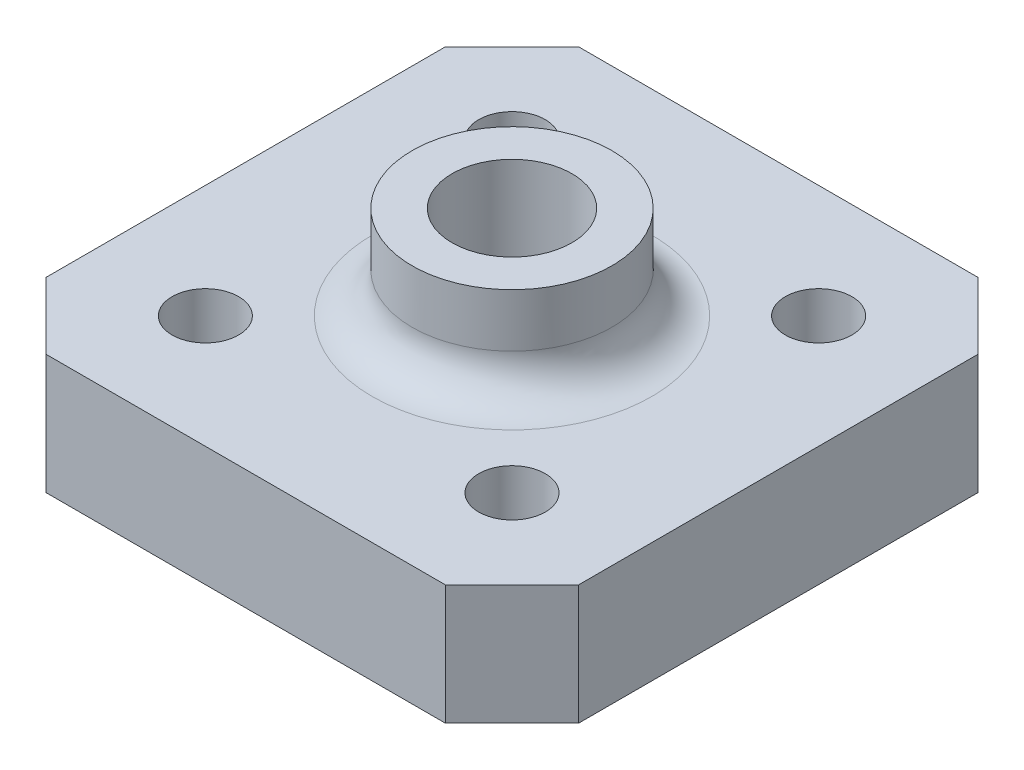
ISO-10303-21;
HEADER;
FILE_DESCRIPTION(('STEP AP214'),'2;1');
FILE_NAME('part.step','',(''),(''),'','','');
FILE_SCHEMA(('AUTOMOTIVE_DESIGN { 1 0 10303 214 1 1 1 1 }'));
ENDSEC;
DATA;
#1=APPLICATION_CONTEXT('core data for automotive mechanical design processes');
#2=APPLICATION_PROTOCOL_DEFINITION('international standard','automotive_design',2000,#1);
#3=PRODUCT_CONTEXT('',#1,'mechanical');
#4=PRODUCT('Part','Part','',(#3));
#5=PRODUCT_RELATED_PRODUCT_CATEGORY('part','',(#4));
#6=PRODUCT_DEFINITION_FORMATION('','',#4);
#7=PRODUCT_DEFINITION_CONTEXT('part definition',#1,'design');
#8=PRODUCT_DEFINITION('design','',#6,#7);
#9=PRODUCT_DEFINITION_SHAPE('','',#8);
#10=(LENGTH_UNIT() NAMED_UNIT(*) SI_UNIT(.MILLI.,.METRE.));
#11=(NAMED_UNIT(*) PLANE_ANGLE_UNIT() SI_UNIT($,.RADIAN.));
#12=(NAMED_UNIT(*) SI_UNIT($,.STERADIAN.) SOLID_ANGLE_UNIT());
#13=UNCERTAINTY_MEASURE_WITH_UNIT(LENGTH_MEASURE(1.E-05),#10,'distance_accuracy_value','');
#14=(GEOMETRIC_REPRESENTATION_CONTEXT(3) GLOBAL_UNCERTAINTY_ASSIGNED_CONTEXT((#13)) GLOBAL_UNIT_ASSIGNED_CONTEXT((#10,
#11,#12)) REPRESENTATION_CONTEXT('',''));
#15=CARTESIAN_POINT('',(0.,0.,0.));
#16=DIRECTION('',(0.,0.,1.));
#17=DIRECTION('',(1.,0.,0.));
#18=AXIS2_PLACEMENT_3D('',#15,#16,#17);
#19=CARTESIAN_POINT('',(0.,9.,0.));
#20=DIRECTION('',(0.,1.,0.));
#21=DIRECTION('',(0.,0.,1.));
#22=AXIS2_PLACEMENT_3D('',#19,#20,#21);
#23=PLANE('',#22);
#24=CARTESIAN_POINT('',(0.,9.,0.));
#25=DIRECTION('',(0.,1.,0.));
#26=DIRECTION('',(0.,0.,1.));
#27=AXIS2_PLACEMENT_3D('',#24,#25,#26);
#28=CIRCLE('',#27,10.5);
#29=CARTESIAN_POINT('',(0.,9.,10.5));
#30=VERTEX_POINT('',#29);
#31=EDGE_CURVE('E205',#30,#30,#28,.F.);
#32=ORIENTED_EDGE('',*,*,#31,.T.);
#33=EDGE_LOOP('',(#32));
#34=FACE_BOUND('',#33,.T.);
#35=DIRECTION('',(-1.,0.,0.));
#36=VECTOR('',#35,1.);
#37=CARTESIAN_POINT('',(-20.,9.,-20.));
#38=LINE('',#37,#36);
#39=CARTESIAN_POINT('',(15.,9.,-20.));
#40=VERTEX_POINT('',#39);
#41=CARTESIAN_POINT('',(-15.,9.,-20.));
#42=VERTEX_POINT('',#41);
#43=EDGE_CURVE('E170',#40,#42,#38,.T.);
#44=ORIENTED_EDGE('',*,*,#43,.T.);
#45=DIRECTION('',(0.707106781186549,0.,-0.707106781186547));
#46=VECTOR('',#45,1.);
#47=CARTESIAN_POINT('',(-17.5,9.,-17.5));
#48=LINE('',#47,#46);
#49=CARTESIAN_POINT('',(-20.,9.,-15.));
#50=VERTEX_POINT('',#49);
#51=EDGE_CURVE('E231',#42,#50,#48,.F.);
#52=ORIENTED_EDGE('',*,*,#51,.T.);
#53=DIRECTION('',(0.,0.,1.));
#54=VECTOR('',#53,1.);
#55=CARTESIAN_POINT('',(-20.,9.,-20.));
#56=LINE('',#55,#54);
#57=CARTESIAN_POINT('',(-20.,9.,15.));
#58=VERTEX_POINT('',#57);
#59=EDGE_CURVE('E260',#50,#58,#56,.T.);
#60=ORIENTED_EDGE('',*,*,#59,.T.);
#61=DIRECTION('',(-0.707106781186547,0.,-0.707106781186549));
#62=VECTOR('',#61,1.);
#63=CARTESIAN_POINT('',(-17.5,9.,17.5));
#64=LINE('',#63,#62);
#65=CARTESIAN_POINT('',(-15.,9.,20.));
#66=VERTEX_POINT('',#65);
#67=EDGE_CURVE('E229',#58,#66,#64,.F.);
#68=ORIENTED_EDGE('',*,*,#67,.T.);
#69=DIRECTION('',(1.,0.,0.));
#70=VECTOR('',#69,1.);
#71=CARTESIAN_POINT('',(-20.,9.,20.));
#72=LINE('',#71,#70);
#73=CARTESIAN_POINT('',(15.,9.,20.));
#74=VERTEX_POINT('',#73);
#75=EDGE_CURVE('E243',#66,#74,#72,.T.);
#76=ORIENTED_EDGE('',*,*,#75,.T.);
#77=DIRECTION('',(-0.707106781186549,0.,0.707106781186546));
#78=VECTOR('',#77,1.);
#79=CARTESIAN_POINT('',(17.5,9.,17.5));
#80=LINE('',#79,#78);
#81=CARTESIAN_POINT('',(20.,9.,15.));
#82=VERTEX_POINT('',#81);
#83=EDGE_CURVE('E54',#74,#82,#80,.F.);
#84=ORIENTED_EDGE('',*,*,#83,.T.);
#85=DIRECTION('',(0.,0.,-1.));
#86=VECTOR('',#85,1.);
#87=CARTESIAN_POINT('',(20.,9.,-20.));
#88=LINE('',#87,#86);
#89=CARTESIAN_POINT('',(20.,9.,-15.));
#90=VERTEX_POINT('',#89);
#91=EDGE_CURVE('E255',#82,#90,#88,.T.);
#92=ORIENTED_EDGE('',*,*,#91,.T.);
#93=DIRECTION('',(0.707106781186547,0.,0.707106781186549));
#94=VECTOR('',#93,1.);
#95=CARTESIAN_POINT('',(17.5,9.,-17.5));
#96=LINE('',#95,#94);
#97=EDGE_CURVE('E226',#90,#40,#96,.F.);
#98=ORIENTED_EDGE('',*,*,#97,.T.);
#99=EDGE_LOOP('',(#44,#52,#60,#68,#76,#84,#92,#98));
#100=FACE_BOUND('',#99,.T.);
#101=CARTESIAN_POINT('',(-11.5147186257614,9.,-11.5147186257614));
#102=DIRECTION('',(0.,1.,0.));
#103=DIRECTION('',(0.,0.,1.));
#104=AXIS2_PLACEMENT_3D('',#101,#102,#103);
#105=CIRCLE('',#104,2.5);
#106=CARTESIAN_POINT('',(-11.5147186257614,9.,-9.01471862576144));
#107=VERTEX_POINT('',#106);
#108=EDGE_CURVE('E534',#107,#107,#105,.T.);
#109=ORIENTED_EDGE('',*,*,#108,.F.);
#110=EDGE_LOOP('',(#109));
#111=FACE_BOUND('',#110,.T.);
#112=CARTESIAN_POINT('',(-11.5147186257614,9.,11.5147186257614));
#113=DIRECTION('',(0.,1.,0.));
#114=DIRECTION('',(0.,0.,1.));
#115=AXIS2_PLACEMENT_3D('',#112,#113,#114);
#116=CIRCLE('',#115,2.5);
#117=CARTESIAN_POINT('',(-11.5147186257614,9.,14.0147186257614));
#118=VERTEX_POINT('',#117);
#119=EDGE_CURVE('E538',#118,#118,#116,.T.);
#120=ORIENTED_EDGE('',*,*,#119,.F.);
#121=EDGE_LOOP('',(#120));
#122=FACE_BOUND('',#121,.T.);
#123=CARTESIAN_POINT('',(11.5147186257614,9.,11.5147186257614));
#124=DIRECTION('',(0.,1.,0.));
#125=DIRECTION('',(0.,0.,1.));
#126=AXIS2_PLACEMENT_3D('',#123,#124,#125);
#127=CIRCLE('',#126,2.5);
#128=CARTESIAN_POINT('',(11.5147186257614,9.,14.0147186257614));
#129=VERTEX_POINT('',#128);
#130=EDGE_CURVE('E542',#129,#129,#127,.T.);
#131=ORIENTED_EDGE('',*,*,#130,.F.);
#132=EDGE_LOOP('',(#131));
#133=FACE_BOUND('',#132,.T.);
#134=CARTESIAN_POINT('',(11.5147186257614,9.,-11.5147186257614));
#135=DIRECTION('',(0.,1.,0.));
#136=DIRECTION('',(0.,0.,1.));
#137=AXIS2_PLACEMENT_3D('',#134,#135,#136);
#138=CIRCLE('',#137,2.5);
#139=CARTESIAN_POINT('',(11.5147186257614,9.,-9.01471862576143));
#140=VERTEX_POINT('',#139);
#141=EDGE_CURVE('E545',#140,#140,#138,.T.);
#142=ORIENTED_EDGE('',*,*,#141,.F.);
#143=EDGE_LOOP('',(#142));
#144=FACE_BOUND('',#143,.T.);
#145=ADVANCED_FACE('F33',(#34,#100,#111,#122,#133,#144),#23,.T.);
#146=CARTESIAN_POINT('',(0.,0.,0.));
#147=DIRECTION('',(0.,1.,0.));
#148=DIRECTION('',(0.,0.,1.));
#149=AXIS2_PLACEMENT_3D('',#146,#147,#148);
#150=PLANE('',#149);
#151=CARTESIAN_POINT('',(11.5147186257614,0.,-11.5147186257614));
#152=DIRECTION('',(0.,1.,0.));
#153=DIRECTION('',(0.,0.,1.));
#154=AXIS2_PLACEMENT_3D('',#151,#152,#153);
#155=CIRCLE('',#154,2.5);
#156=CARTESIAN_POINT('',(11.5147186257614,0.,-9.01471862576143));
#157=VERTEX_POINT('',#156);
#158=EDGE_CURVE('E559',#157,#157,#155,.T.);
#159=ORIENTED_EDGE('',*,*,#158,.T.);
#160=EDGE_LOOP('',(#159));
#161=FACE_BOUND('',#160,.T.);
#162=CARTESIAN_POINT('',(11.5147186257614,0.,11.5147186257614));
#163=DIRECTION('',(0.,1.,0.));
#164=DIRECTION('',(0.,0.,1.));
#165=AXIS2_PLACEMENT_3D('',#162,#163,#164);
#166=CIRCLE('',#165,2.5);
#167=CARTESIAN_POINT('',(11.5147186257614,0.,14.0147186257614));
#168=VERTEX_POINT('',#167);
#169=EDGE_CURVE('E549',#168,#168,#166,.T.);
#170=ORIENTED_EDGE('',*,*,#169,.T.);
#171=EDGE_LOOP('',(#170));
#172=FACE_BOUND('',#171,.T.);
#173=CARTESIAN_POINT('',(-11.5147186257614,0.,11.5147186257614));
#174=DIRECTION('',(0.,1.,0.));
#175=DIRECTION('',(0.,0.,1.));
#176=AXIS2_PLACEMENT_3D('',#173,#174,#175);
#177=CIRCLE('',#176,2.5);
#178=CARTESIAN_POINT('',(-11.5147186257614,0.,14.0147186257614));
#179=VERTEX_POINT('',#178);
#180=EDGE_CURVE('E546',#179,#179,#177,.T.);
#181=ORIENTED_EDGE('',*,*,#180,.T.);
#182=EDGE_LOOP('',(#181));
#183=FACE_BOUND('',#182,.T.);
#184=CARTESIAN_POINT('',(-11.5147186257614,0.,-11.5147186257614));
#185=DIRECTION('',(0.,1.,0.));
#186=DIRECTION('',(0.,0.,1.));
#187=AXIS2_PLACEMENT_3D('',#184,#185,#186);
#188=CIRCLE('',#187,2.5);
#189=CARTESIAN_POINT('',(-11.5147186257614,0.,-9.01471862576144));
#190=VERTEX_POINT('',#189);
#191=EDGE_CURVE('E563',#190,#190,#188,.T.);
#192=ORIENTED_EDGE('',*,*,#191,.T.);
#193=EDGE_LOOP('',(#192));
#194=FACE_BOUND('',#193,.T.);
#195=DIRECTION('',(0.,0.,1.));
#196=VECTOR('',#195,1.);
#197=CARTESIAN_POINT('',(-20.,0.,-20.));
#198=LINE('',#197,#196);
#199=CARTESIAN_POINT('',(-20.,0.,-15.));
#200=VERTEX_POINT('',#199);
#201=CARTESIAN_POINT('',(-20.,0.,15.));
#202=VERTEX_POINT('',#201);
#203=EDGE_CURVE('E196',#200,#202,#198,.T.);
#204=ORIENTED_EDGE('',*,*,#203,.F.);
#205=DIRECTION('',(-0.707106781186549,0.,0.707106781186547));
#206=VECTOR('',#205,1.);
#207=CARTESIAN_POINT('',(-20.,0.,-15.));
#208=LINE('',#207,#206);
#209=CARTESIAN_POINT('',(-15.,0.,-20.));
#210=VERTEX_POINT('',#209);
#211=EDGE_CURVE('E219',#200,#210,#208,.F.);
#212=ORIENTED_EDGE('',*,*,#211,.T.);
#213=DIRECTION('',(-1.,0.,0.));
#214=VECTOR('',#213,1.);
#215=CARTESIAN_POINT('',(-20.,0.,-20.));
#216=LINE('',#215,#214);
#217=CARTESIAN_POINT('',(15.,0.,-20.));
#218=VERTEX_POINT('',#217);
#219=EDGE_CURVE('E193',#218,#210,#216,.T.);
#220=ORIENTED_EDGE('',*,*,#219,.F.);
#221=DIRECTION('',(-0.707106781186547,0.,-0.707106781186549));
#222=VECTOR('',#221,1.);
#223=CARTESIAN_POINT('',(15.,0.,-20.));
#224=LINE('',#223,#222);
#225=CARTESIAN_POINT('',(20.,0.,-15.));
#226=VERTEX_POINT('',#225);
#227=EDGE_CURVE('E213',#218,#226,#224,.F.);
#228=ORIENTED_EDGE('',*,*,#227,.T.);
#229=DIRECTION('',(0.,0.,-1.));
#230=VECTOR('',#229,1.);
#231=CARTESIAN_POINT('',(20.,0.,-20.));
#232=LINE('',#231,#230);
#233=CARTESIAN_POINT('',(20.,0.,15.));
#234=VERTEX_POINT('',#233);
#235=EDGE_CURVE('E191',#234,#226,#232,.T.);
#236=ORIENTED_EDGE('',*,*,#235,.F.);
#237=DIRECTION('',(0.707106781186549,0.,-0.707106781186546));
#238=VECTOR('',#237,1.);
#239=CARTESIAN_POINT('',(20.,0.,15.));
#240=LINE('',#239,#238);
#241=CARTESIAN_POINT('',(15.,0.,20.));
#242=VERTEX_POINT('',#241);
#243=EDGE_CURVE('E215',#234,#242,#240,.F.);
#244=ORIENTED_EDGE('',*,*,#243,.T.);
#245=DIRECTION('',(1.,0.,0.));
#246=VECTOR('',#245,1.);
#247=CARTESIAN_POINT('',(-20.,0.,20.));
#248=LINE('',#247,#246);
#249=CARTESIAN_POINT('',(-15.,0.,20.));
#250=VERTEX_POINT('',#249);
#251=EDGE_CURVE('E199',#250,#242,#248,.T.);
#252=ORIENTED_EDGE('',*,*,#251,.F.);
#253=DIRECTION('',(0.707106781186547,0.,0.707106781186549));
#254=VECTOR('',#253,1.);
#255=CARTESIAN_POINT('',(-15.,0.,20.));
#256=LINE('',#255,#254);
#257=EDGE_CURVE('E217',#250,#202,#256,.F.);
#258=ORIENTED_EDGE('',*,*,#257,.T.);
#259=EDGE_LOOP('',(#204,#212,#220,#228,#236,#244,#252,#258));
#260=FACE_BOUND('',#259,.T.);
#261=DIRECTION('',(0.5,0.,-0.866025403784439));
#262=VECTOR('',#261,1.);
#263=CARTESIAN_POINT('',(3.75277674973256,0.,6.5));
#264=LINE('',#263,#262);
#265=CARTESIAN_POINT('',(3.75277674973256,0.,6.5));
#266=VERTEX_POINT('',#265);
#267=CARTESIAN_POINT('',(7.50555349946513,0.,0.));
#268=VERTEX_POINT('',#267);
#269=EDGE_CURVE('E166',#266,#268,#264,.T.);
#270=ORIENTED_EDGE('',*,*,#269,.T.);
#271=DIRECTION('',(-0.5,0.,-0.866025403784439));
#272=VECTOR('',#271,1.);
#273=CARTESIAN_POINT('',(7.50555349946513,0.,0.));
#274=LINE('',#273,#272);
#275=CARTESIAN_POINT('',(3.75277674973256,0.,-6.5));
#276=VERTEX_POINT('',#275);
#277=EDGE_CURVE('E169',#268,#276,#274,.T.);
#278=ORIENTED_EDGE('',*,*,#277,.T.);
#279=DIRECTION('',(-1.,0.,0.));
#280=VECTOR('',#279,1.);
#281=CARTESIAN_POINT('',(3.75277674973256,0.,-6.5));
#282=LINE('',#281,#280);
#283=CARTESIAN_POINT('',(-3.75277674973257,0.,-6.5));
#284=VERTEX_POINT('',#283);
#285=EDGE_CURVE('E173',#276,#284,#282,.T.);
#286=ORIENTED_EDGE('',*,*,#285,.T.);
#287=DIRECTION('',(-0.5,0.,0.866025403784438));
#288=VECTOR('',#287,1.);
#289=CARTESIAN_POINT('',(-3.75277674973257,0.,-6.5));
#290=LINE('',#289,#288);
#291=CARTESIAN_POINT('',(-7.50555349946514,0.,0.));
#292=VERTEX_POINT('',#291);
#293=EDGE_CURVE('E176',#284,#292,#290,.T.);
#294=ORIENTED_EDGE('',*,*,#293,.T.);
#295=DIRECTION('',(0.5,0.,0.866025403784439));
#296=VECTOR('',#295,1.);
#297=CARTESIAN_POINT('',(-7.50555349946514,0.,0.));
#298=LINE('',#297,#296);
#299=CARTESIAN_POINT('',(-3.75277674973257,0.,6.5));
#300=VERTEX_POINT('',#299);
#301=EDGE_CURVE('E179',#292,#300,#298,.T.);
#302=ORIENTED_EDGE('',*,*,#301,.T.);
#303=DIRECTION('',(1.,0.,0.));
#304=VECTOR('',#303,1.);
#305=CARTESIAN_POINT('',(-3.75277674973257,0.,6.5));
#306=LINE('',#305,#304);
#307=EDGE_CURVE('E152',#300,#266,#306,.T.);
#308=ORIENTED_EDGE('',*,*,#307,.T.);
#309=EDGE_LOOP('',(#270,#278,#286,#294,#302,#308));
#310=FACE_BOUND('',#309,.T.);
#311=ADVANCED_FACE('F248',(#161,#172,#183,#194,#260,#310),#150,.F.);
#312=CARTESIAN_POINT('',(20.,6.,-20.));
#313=DIRECTION('',(-1.,0.,0.));
#314=DIRECTION('',(0.,0.,1.));
#315=AXIS2_PLACEMENT_3D('',#312,#313,#314);
#316=PLANE('',#315);
#317=ORIENTED_EDGE('',*,*,#91,.F.);
#318=DIRECTION('',(0.,-1.,0.));
#319=VECTOR('',#318,1.);
#320=CARTESIAN_POINT('',(20.,6.,15.));
#321=LINE('',#320,#319);
#322=EDGE_CURVE('E11',#82,#234,#321,.T.);
#323=ORIENTED_EDGE('',*,*,#322,.T.);
#324=ORIENTED_EDGE('',*,*,#235,.T.);
#325=DIRECTION('',(0.,1.,0.));
#326=VECTOR('',#325,1.);
#327=CARTESIAN_POINT('',(20.,6.,-15.));
#328=LINE('',#327,#326);
#329=EDGE_CURVE('E41',#226,#90,#328,.T.);
#330=ORIENTED_EDGE('',*,*,#329,.T.);
#331=EDGE_LOOP('',(#317,#323,#324,#330));
#332=FACE_BOUND('',#331,.T.);
#333=ADVANCED_FACE('F254',(#332),#316,.F.);
#334=CARTESIAN_POINT('',(-20.,6.,-20.));
#335=DIRECTION('',(0.,0.,1.));
#336=DIRECTION('',(1.,0.,0.));
#337=AXIS2_PLACEMENT_3D('',#334,#335,#336);
#338=PLANE('',#337);
#339=ORIENTED_EDGE('',*,*,#219,.T.);
#340=DIRECTION('',(0.,1.,0.));
#341=VECTOR('',#340,1.);
#342=CARTESIAN_POINT('',(-15.,6.,-20.));
#343=LINE('',#342,#341);
#344=EDGE_CURVE('E224',#210,#42,#343,.T.);
#345=ORIENTED_EDGE('',*,*,#344,.T.);
#346=ORIENTED_EDGE('',*,*,#43,.F.);
#347=DIRECTION('',(0.,-1.,0.));
#348=VECTOR('',#347,1.);
#349=CARTESIAN_POINT('',(15.,6.,-20.));
#350=LINE('',#349,#348);
#351=EDGE_CURVE('E221',#40,#218,#350,.T.);
#352=ORIENTED_EDGE('',*,*,#351,.T.);
#353=EDGE_LOOP('',(#339,#345,#346,#352));
#354=FACE_BOUND('',#353,.T.);
#355=ADVANCED_FACE('F464',(#354),#338,.F.);
#356=CARTESIAN_POINT('',(-20.,6.,-20.));
#357=DIRECTION('',(1.,0.,0.));
#358=DIRECTION('',(0.,0.,-1.));
#359=AXIS2_PLACEMENT_3D('',#356,#357,#358);
#360=PLANE('',#359);
#361=ORIENTED_EDGE('',*,*,#59,.F.);
#362=DIRECTION('',(0.,-1.,0.));
#363=VECTOR('',#362,1.);
#364=CARTESIAN_POINT('',(-20.,6.,-15.));
#365=LINE('',#364,#363);
#366=EDGE_CURVE('E210',#50,#200,#365,.T.);
#367=ORIENTED_EDGE('',*,*,#366,.T.);
#368=ORIENTED_EDGE('',*,*,#203,.T.);
#369=DIRECTION('',(0.,1.,0.));
#370=VECTOR('',#369,1.);
#371=CARTESIAN_POINT('',(-20.,6.,15.));
#372=LINE('',#371,#370);
#373=EDGE_CURVE('E208',#202,#58,#372,.T.);
#374=ORIENTED_EDGE('',*,*,#373,.T.);
#375=EDGE_LOOP('',(#361,#367,#368,#374));
#376=FACE_BOUND('',#375,.T.);
#377=ADVANCED_FACE('F288',(#376),#360,.F.);
#378=CARTESIAN_POINT('',(-20.,6.,20.));
#379=DIRECTION('',(0.,0.,-1.));
#380=DIRECTION('',(-1.,0.,0.));
#381=AXIS2_PLACEMENT_3D('',#378,#379,#380);
#382=PLANE('',#381);
#383=ORIENTED_EDGE('',*,*,#75,.F.);
#384=DIRECTION('',(0.,-1.,0.));
#385=VECTOR('',#384,1.);
#386=CARTESIAN_POINT('',(-15.,6.,20.));
#387=LINE('',#386,#385);
#388=EDGE_CURVE('E235',#66,#250,#387,.T.);
#389=ORIENTED_EDGE('',*,*,#388,.T.);
#390=ORIENTED_EDGE('',*,*,#251,.T.);
#391=DIRECTION('',(0.,1.,0.));
#392=VECTOR('',#391,1.);
#393=CARTESIAN_POINT('',(15.,6.,20.));
#394=LINE('',#393,#392);
#395=EDGE_CURVE('E233',#242,#74,#394,.T.);
#396=ORIENTED_EDGE('',*,*,#395,.T.);
#397=EDGE_LOOP('',(#383,#389,#390,#396));
#398=FACE_BOUND('',#397,.T.);
#399=ADVANCED_FACE('F241',(#398),#382,.F.);
#400=CARTESIAN_POINT('',(3.75277674973256,6.,6.5));
#401=DIRECTION('',(-0.866025403784439,0.,-0.5));
#402=DIRECTION('',(-0.5,0.,0.866025403784439));
#403=AXIS2_PLACEMENT_3D('',#400,#401,#402);
#404=PLANE('',#403);
#405=ORIENTED_EDGE('',*,*,#269,.F.);
#406=DIRECTION('',(0.,-1.,0.));
#407=VECTOR('',#406,1.);
#408=CARTESIAN_POINT('',(3.75277674973256,6.,6.5));
#409=LINE('',#408,#407);
#410=CARTESIAN_POINT('',(3.75277674973256,6.,6.5));
#411=VERTEX_POINT('',#410);
#412=EDGE_CURVE('E146',#411,#266,#409,.T.);
#413=ORIENTED_EDGE('',*,*,#412,.F.);
#414=DIRECTION('',(0.5,0.,-0.866025403784439));
#415=VECTOR('',#414,1.);
#416=CARTESIAN_POINT('',(3.75277674973256,6.,6.5));
#417=LINE('',#416,#415);
#418=CARTESIAN_POINT('',(7.50555349946513,6.,0.));
#419=VERTEX_POINT('',#418);
#420=EDGE_CURVE('E142',#411,#419,#417,.T.);
#421=ORIENTED_EDGE('',*,*,#420,.T.);
#422=DIRECTION('',(0.,-1.,0.));
#423=VECTOR('',#422,1.);
#424=CARTESIAN_POINT('',(7.50555349946513,6.,0.));
#425=LINE('',#424,#423);
#426=EDGE_CURVE('E188',#419,#268,#425,.T.);
#427=ORIENTED_EDGE('',*,*,#426,.T.);
#428=EDGE_LOOP('',(#405,#413,#421,#427));
#429=FACE_BOUND('',#428,.T.);
#430=ADVANCED_FACE('F280',(#429),#404,.T.);
#431=CARTESIAN_POINT('',(7.50555349946513,6.,0.));
#432=DIRECTION('',(-0.866025403784439,0.,0.5));
#433=DIRECTION('',(0.5,0.,0.866025403784439));
#434=AXIS2_PLACEMENT_3D('',#431,#432,#433);
#435=PLANE('',#434);
#436=ORIENTED_EDGE('',*,*,#277,.F.);
#437=ORIENTED_EDGE('',*,*,#426,.F.);
#438=DIRECTION('',(-0.5,0.,-0.866025403784439));
#439=VECTOR('',#438,1.);
#440=CARTESIAN_POINT('',(7.50555349946513,6.,0.));
#441=LINE('',#440,#439);
#442=CARTESIAN_POINT('',(3.75277674973256,6.,-6.5));
#443=VERTEX_POINT('',#442);
#444=EDGE_CURVE('E265',#419,#443,#441,.T.);
#445=ORIENTED_EDGE('',*,*,#444,.T.);
#446=DIRECTION('',(0.,-1.,0.));
#447=VECTOR('',#446,1.);
#448=CARTESIAN_POINT('',(3.75277674973256,6.,-6.5));
#449=LINE('',#448,#447);
#450=EDGE_CURVE('E186',#443,#276,#449,.T.);
#451=ORIENTED_EDGE('',*,*,#450,.T.);
#452=EDGE_LOOP('',(#436,#437,#445,#451));
#453=FACE_BOUND('',#452,.T.);
#454=ADVANCED_FACE('F278',(#453),#435,.T.);
#455=CARTESIAN_POINT('',(3.75277674973256,6.,-6.5));
#456=DIRECTION('',(0.,0.,1.));
#457=DIRECTION('',(1.,0.,0.));
#458=AXIS2_PLACEMENT_3D('',#455,#456,#457);
#459=PLANE('',#458);
#460=ORIENTED_EDGE('',*,*,#285,.F.);
#461=ORIENTED_EDGE('',*,*,#450,.F.);
#462=DIRECTION('',(-1.,0.,0.));
#463=VECTOR('',#462,1.);
#464=CARTESIAN_POINT('',(3.75277674973256,6.,-6.5));
#465=LINE('',#464,#463);
#466=CARTESIAN_POINT('',(-3.75277674973257,6.,-6.5));
#467=VERTEX_POINT('',#466);
#468=EDGE_CURVE('E162',#443,#467,#465,.T.);
#469=ORIENTED_EDGE('',*,*,#468,.T.);
#470=DIRECTION('',(0.,-1.,0.));
#471=VECTOR('',#470,1.);
#472=CARTESIAN_POINT('',(-3.75277674973257,6.,-6.5));
#473=LINE('',#472,#471);
#474=EDGE_CURVE('E184',#467,#284,#473,.T.);
#475=ORIENTED_EDGE('',*,*,#474,.T.);
#476=EDGE_LOOP('',(#460,#461,#469,#475));
#477=FACE_BOUND('',#476,.T.);
#478=ADVANCED_FACE('F272',(#477),#459,.T.);
#479=CARTESIAN_POINT('',(-3.75277674973257,6.,-6.5));
#480=DIRECTION('',(0.866025403784439,0.,0.5));
#481=DIRECTION('',(0.5,0.,-0.866025403784439));
#482=AXIS2_PLACEMENT_3D('',#479,#480,#481);
#483=PLANE('',#482);
#484=ORIENTED_EDGE('',*,*,#293,.F.);
#485=ORIENTED_EDGE('',*,*,#474,.F.);
#486=DIRECTION('',(-0.5,0.,0.866025403784438));
#487=VECTOR('',#486,1.);
#488=CARTESIAN_POINT('',(-3.75277674973257,6.,-6.5));
#489=LINE('',#488,#487);
#490=CARTESIAN_POINT('',(-7.50555349946514,6.,0.));
#491=VERTEX_POINT('',#490);
#492=EDGE_CURVE('E160',#467,#491,#489,.T.);
#493=ORIENTED_EDGE('',*,*,#492,.T.);
#494=DIRECTION('',(0.,-1.,0.));
#495=VECTOR('',#494,1.);
#496=CARTESIAN_POINT('',(-7.50555349946514,6.,0.));
#497=LINE('',#496,#495);
#498=EDGE_CURVE('E156',#491,#292,#497,.T.);
#499=ORIENTED_EDGE('',*,*,#498,.T.);
#500=EDGE_LOOP('',(#484,#485,#493,#499));
#501=FACE_BOUND('',#500,.T.);
#502=ADVANCED_FACE('F275',(#501),#483,.T.);
#503=CARTESIAN_POINT('',(-7.50555349946514,6.,0.));
#504=DIRECTION('',(0.866025403784439,0.,-0.5));
#505=DIRECTION('',(-0.5,0.,-0.866025403784439));
#506=AXIS2_PLACEMENT_3D('',#503,#504,#505);
#507=PLANE('',#506);
#508=ORIENTED_EDGE('',*,*,#301,.F.);
#509=ORIENTED_EDGE('',*,*,#498,.F.);
#510=DIRECTION('',(0.5,0.,0.866025403784439));
#511=VECTOR('',#510,1.);
#512=CARTESIAN_POINT('',(-7.50555349946514,6.,0.));
#513=LINE('',#512,#511);
#514=CARTESIAN_POINT('',(-3.75277674973257,6.,6.5));
#515=VERTEX_POINT('',#514);
#516=EDGE_CURVE('E139',#491,#515,#513,.T.);
#517=ORIENTED_EDGE('',*,*,#516,.T.);
#518=DIRECTION('',(0.,-1.,0.));
#519=VECTOR('',#518,1.);
#520=CARTESIAN_POINT('',(-3.75277674973257,6.,6.5));
#521=LINE('',#520,#519);
#522=EDGE_CURVE('E149',#515,#300,#521,.T.);
#523=ORIENTED_EDGE('',*,*,#522,.T.);
#524=EDGE_LOOP('',(#508,#509,#517,#523));
#525=FACE_BOUND('',#524,.T.);
#526=ADVANCED_FACE('F159',(#525),#507,.T.);
#527=CARTESIAN_POINT('',(-3.75277674973257,6.,6.5));
#528=DIRECTION('',(0.,0.,-1.));
#529=DIRECTION('',(-1.,0.,0.));
#530=AXIS2_PLACEMENT_3D('',#527,#528,#529);
#531=PLANE('',#530);
#532=ORIENTED_EDGE('',*,*,#307,.F.);
#533=ORIENTED_EDGE('',*,*,#522,.F.);
#534=DIRECTION('',(1.,0.,0.));
#535=VECTOR('',#534,1.);
#536=CARTESIAN_POINT('',(-3.75277674973257,6.,6.5));
#537=LINE('',#536,#535);
#538=EDGE_CURVE('E134',#515,#411,#537,.T.);
#539=ORIENTED_EDGE('',*,*,#538,.T.);
#540=ORIENTED_EDGE('',*,*,#412,.T.);
#541=EDGE_LOOP('',(#532,#533,#539,#540));
#542=FACE_BOUND('',#541,.T.);
#543=ADVANCED_FACE('F150',(#542),#531,.T.);
#544=CARTESIAN_POINT('',(0.,6.,0.));
#545=DIRECTION('',(0.,1.,0.));
#546=DIRECTION('',(0.,0.,1.));
#547=AXIS2_PLACEMENT_3D('',#544,#545,#546);
#548=PLANE('',#547);
#549=ORIENTED_EDGE('',*,*,#420,.F.);
#550=ORIENTED_EDGE('',*,*,#538,.F.);
#551=ORIENTED_EDGE('',*,*,#516,.F.);
#552=ORIENTED_EDGE('',*,*,#492,.F.);
#553=ORIENTED_EDGE('',*,*,#468,.F.);
#554=ORIENTED_EDGE('',*,*,#444,.F.);
#555=EDGE_LOOP('',(#549,#550,#551,#552,#553,#554));
#556=FACE_BOUND('',#555,.T.);
#557=CARTESIAN_POINT('',(0.,6.,0.));
#558=DIRECTION('',(0.,1.,0.));
#559=DIRECTION('',(0.,0.,1.));
#560=AXIS2_PLACEMENT_3D('',#557,#558,#559);
#561=CIRCLE('',#560,4.5);
#562=CARTESIAN_POINT('',(0.,6.,4.5));
#563=VERTEX_POINT('',#562);
#564=EDGE_CURVE('E524',#563,#563,#561,.T.);
#565=ORIENTED_EDGE('',*,*,#564,.T.);
#566=EDGE_LOOP('',(#565));
#567=FACE_BOUND('',#566,.T.);
#568=ADVANCED_FACE('F136',(#556,#567),#548,.F.);
#569=CARTESIAN_POINT('',(0.,9.,0.));
#570=DIRECTION('',(0.,-1.,0.));
#571=DIRECTION('',(0.,0.,-1.));
#572=AXIS2_PLACEMENT_3D('',#569,#570,#571);
#573=CYLINDRICAL_SURFACE('',#572,4.5);
#574=ORIENTED_EDGE('',*,*,#564,.F.);
#575=EDGE_LOOP('',(#574));
#576=FACE_BOUND('',#575,.T.);
#577=CARTESIAN_POINT('',(0.,16.,0.));
#578=DIRECTION('',(0.,1.,0.));
#579=DIRECTION('',(0.,0.,1.));
#580=AXIS2_PLACEMENT_3D('',#577,#578,#579);
#581=CIRCLE('',#580,4.5);
#582=CARTESIAN_POINT('',(0.,16.,4.5));
#583=VERTEX_POINT('',#582);
#584=EDGE_CURVE('E571',#583,#583,#581,.T.);
#585=ORIENTED_EDGE('',*,*,#584,.T.);
#586=EDGE_LOOP('',(#585));
#587=FACE_BOUND('',#586,.T.);
#588=ADVANCED_FACE('F300',(#576,#587),#573,.F.);
#589=CARTESIAN_POINT('',(-11.5147186257614,-15.,-11.5147186257614));
#590=DIRECTION('',(0.,1.,0.));
#591=DIRECTION('',(0.,0.,1.));
#592=AXIS2_PLACEMENT_3D('',#589,#590,#591);
#593=CYLINDRICAL_SURFACE('',#592,2.5);
#594=ORIENTED_EDGE('',*,*,#108,.T.);
#595=EDGE_LOOP('',(#594));
#596=FACE_BOUND('',#595,.T.);
#597=ORIENTED_EDGE('',*,*,#191,.F.);
#598=EDGE_LOOP('',(#597));
#599=FACE_BOUND('',#598,.T.);
#600=ADVANCED_FACE('F338',(#596,#599),#593,.F.);
#601=CARTESIAN_POINT('',(-11.5147186257614,-15.,11.5147186257614));
#602=DIRECTION('',(0.,1.,0.));
#603=DIRECTION('',(0.,0.,1.));
#604=AXIS2_PLACEMENT_3D('',#601,#602,#603);
#605=CYLINDRICAL_SURFACE('',#604,2.5);
#606=ORIENTED_EDGE('',*,*,#119,.T.);
#607=EDGE_LOOP('',(#606));
#608=FACE_BOUND('',#607,.T.);
#609=ORIENTED_EDGE('',*,*,#180,.F.);
#610=EDGE_LOOP('',(#609));
#611=FACE_BOUND('',#610,.T.);
#612=ADVANCED_FACE('F346',(#608,#611),#605,.F.);
#613=CARTESIAN_POINT('',(11.5147186257614,-15.,11.5147186257614));
#614=DIRECTION('',(0.,1.,0.));
#615=DIRECTION('',(0.,0.,1.));
#616=AXIS2_PLACEMENT_3D('',#613,#614,#615);
#617=CYLINDRICAL_SURFACE('',#616,2.5);
#618=ORIENTED_EDGE('',*,*,#130,.T.);
#619=EDGE_LOOP('',(#618));
#620=FACE_BOUND('',#619,.T.);
#621=ORIENTED_EDGE('',*,*,#169,.F.);
#622=EDGE_LOOP('',(#621));
#623=FACE_BOUND('',#622,.T.);
#624=ADVANCED_FACE('F353',(#620,#623),#617,.F.);
#625=CARTESIAN_POINT('',(11.5147186257614,-15.,-11.5147186257614));
#626=DIRECTION('',(0.,1.,0.));
#627=DIRECTION('',(0.,0.,1.));
#628=AXIS2_PLACEMENT_3D('',#625,#626,#627);
#629=CYLINDRICAL_SURFACE('',#628,2.5);
#630=ORIENTED_EDGE('',*,*,#141,.T.);
#631=EDGE_LOOP('',(#630));
#632=FACE_BOUND('',#631,.T.);
#633=ORIENTED_EDGE('',*,*,#158,.F.);
#634=EDGE_LOOP('',(#633));
#635=FACE_BOUND('',#634,.T.);
#636=ADVANCED_FACE('F361',(#632,#635),#629,.F.);
#637=CARTESIAN_POINT('',(0.,16.,0.));
#638=DIRECTION('',(0.,1.,0.));
#639=DIRECTION('',(0.,0.,1.));
#640=AXIS2_PLACEMENT_3D('',#637,#638,#639);
#641=PLANE('',#640);
#642=CARTESIAN_POINT('',(0.,16.,0.));
#643=DIRECTION('',(0.,1.,0.));
#644=DIRECTION('',(0.,0.,1.));
#645=AXIS2_PLACEMENT_3D('',#642,#643,#644);
#646=CIRCLE('',#645,7.5);
#647=CARTESIAN_POINT('',(0.,16.,-7.5));
#648=VERTEX_POINT('',#647);
#649=EDGE_CURVE('E553',#648,#648,#646,.T.);
#650=ORIENTED_EDGE('',*,*,#649,.T.);
#651=EDGE_LOOP('',(#650));
#652=FACE_BOUND('',#651,.T.);
#653=ORIENTED_EDGE('',*,*,#584,.F.);
#654=EDGE_LOOP('',(#653));
#655=FACE_BOUND('',#654,.T.);
#656=ADVANCED_FACE('F368',(#652,#655),#641,.T.);
#657=CARTESIAN_POINT('',(0.,16.,0.));
#658=DIRECTION('',(0.,-1.,0.));
#659=DIRECTION('',(0.,0.,-1.));
#660=AXIS2_PLACEMENT_3D('',#657,#658,#659);
#661=CYLINDRICAL_SURFACE('',#660,7.5);
#662=CARTESIAN_POINT('',(0.,12.,0.));
#663=DIRECTION('',(0.,1.,0.));
#664=DIRECTION('',(0.,0.,1.));
#665=AXIS2_PLACEMENT_3D('',#662,#663,#664);
#666=CIRCLE('',#665,7.5);
#667=CARTESIAN_POINT('',(0.,12.,-7.5));
#668=VERTEX_POINT('',#667);
#669=EDGE_CURVE('E202',#668,#668,#666,.T.);
#670=CARTESIAN_POINT('',(0.,12.,-7.5));
#671=CARTESIAN_POINT('',(0.,12.0416666666667,-7.5));
#672=CARTESIAN_POINT('',(0.,12.0833333333333,-7.5));
#673=CARTESIAN_POINT('',(0.,12.1666666666667,-7.5));
#674=CARTESIAN_POINT('',(0.,12.2083333333333,-7.5));
#675=CARTESIAN_POINT('',(0.,12.2916666666667,-7.5));
#676=CARTESIAN_POINT('',(0.,12.3333333333333,-7.5));
#677=CARTESIAN_POINT('',(0.,12.4166666666667,-7.5));
#678=CARTESIAN_POINT('',(0.,12.4583333333333,-7.5));
#679=CARTESIAN_POINT('',(0.,12.5416666666667,-7.5));
#680=CARTESIAN_POINT('',(0.,12.5833333333333,-7.5));
#681=CARTESIAN_POINT('',(0.,12.6666666666667,-7.5));
#682=CARTESIAN_POINT('',(0.,12.7083333333333,-7.5));
#683=CARTESIAN_POINT('',(0.,12.7916666666667,-7.5));
#684=CARTESIAN_POINT('',(0.,12.8333333333333,-7.5));
#685=CARTESIAN_POINT('',(0.,12.9166666666667,-7.5));
#686=CARTESIAN_POINT('',(0.,12.9583333333333,-7.5));
#687=CARTESIAN_POINT('',(0.,13.0416666666667,-7.5));
#688=CARTESIAN_POINT('',(0.,13.0833333333333,-7.5));
#689=CARTESIAN_POINT('',(0.,13.1666666666667,-7.5));
#690=CARTESIAN_POINT('',(0.,13.2083333333333,-7.5));
#691=CARTESIAN_POINT('',(0.,13.2916666666667,-7.5));
#692=CARTESIAN_POINT('',(0.,13.3333333333333,-7.5));
#693=CARTESIAN_POINT('',(0.,13.4166666666667,-7.5));
#694=CARTESIAN_POINT('',(0.,13.4583333333333,-7.5));
#695=CARTESIAN_POINT('',(0.,13.5416666666667,-7.5));
#696=CARTESIAN_POINT('',(0.,13.5833333333333,-7.5));
#697=CARTESIAN_POINT('',(0.,13.6666666666667,-7.5));
#698=CARTESIAN_POINT('',(0.,13.7083333333333,-7.5));
#699=CARTESIAN_POINT('',(0.,13.7916666666667,-7.5));
#700=CARTESIAN_POINT('',(0.,13.8333333333333,-7.5));
#701=CARTESIAN_POINT('',(0.,13.9166666666667,-7.5));
#702=CARTESIAN_POINT('',(0.,13.9583333333333,-7.5));
#703=CARTESIAN_POINT('',(0.,14.0416666666667,-7.5));
#704=CARTESIAN_POINT('',(0.,14.0833333333333,-7.5));
#705=CARTESIAN_POINT('',(0.,14.1666666666667,-7.5));
#706=CARTESIAN_POINT('',(0.,14.2083333333333,-7.5));
#707=CARTESIAN_POINT('',(0.,14.2916666666667,-7.5));
#708=CARTESIAN_POINT('',(0.,14.3333333333333,-7.5));
#709=CARTESIAN_POINT('',(0.,14.4166666666667,-7.5));
#710=CARTESIAN_POINT('',(0.,14.4583333333333,-7.5));
#711=CARTESIAN_POINT('',(0.,14.5416666666667,-7.5));
#712=CARTESIAN_POINT('',(0.,14.5833333333333,-7.5));
#713=CARTESIAN_POINT('',(0.,14.6666666666667,-7.5));
#714=CARTESIAN_POINT('',(0.,14.7083333333333,-7.5));
#715=CARTESIAN_POINT('',(0.,14.7916666666667,-7.5));
#716=CARTESIAN_POINT('',(0.,14.8333333333333,-7.5));
#717=CARTESIAN_POINT('',(0.,14.9166666666667,-7.5));
#718=CARTESIAN_POINT('',(0.,14.9583333333333,-7.5));
#719=CARTESIAN_POINT('',(0.,15.0416666666667,-7.5));
#720=CARTESIAN_POINT('',(0.,15.0833333333333,-7.5));
#721=CARTESIAN_POINT('',(0.,15.1666666666667,-7.5));
#722=CARTESIAN_POINT('',(0.,15.2083333333333,-7.5));
#723=CARTESIAN_POINT('',(0.,15.2916666666667,-7.5));
#724=CARTESIAN_POINT('',(0.,15.3333333333333,-7.5));
#725=CARTESIAN_POINT('',(0.,15.4166666666667,-7.5));
#726=CARTESIAN_POINT('',(0.,15.4583333333333,-7.5));
#727=CARTESIAN_POINT('',(0.,15.5416666666667,-7.5));
#728=CARTESIAN_POINT('',(0.,15.5833333333333,-7.5));
#729=CARTESIAN_POINT('',(0.,15.6666666666667,-7.5));
#730=CARTESIAN_POINT('',(0.,15.7083333333333,-7.5));
#731=CARTESIAN_POINT('',(0.,15.7916666666667,-7.5));
#732=CARTESIAN_POINT('',(0.,15.8333333333333,-7.5));
#733=CARTESIAN_POINT('',(0.,15.9166666666667,-7.5));
#734=CARTESIAN_POINT('',(0.,15.9583333333333,-7.5));
#735=CARTESIAN_POINT('',(0.,16.,-7.5));
#736=B_SPLINE_CURVE_WITH_KNOTS('',3,(#670,#671,#672,#673,#674,#675,#676,#677,#678,#679,#680,
#681,#682,#683,#684,#685,#686,#687,#688,#689,#690,#691,#692,#693,#694,#695,#696,#697,#698,#699,
#700,#701,#702,#703,#704,#705,#706,#707,#708,#709,#710,#711,#712,#713,#714,#715,#716,#717,#718,
#719,#720,#721,#722,#723,#724,#725,#726,#727,#728,#729,#730,#731,#732,#733,#734,#735),
.UNSPECIFIED.,.F.,.F.,(4,2,2,2,2,2,2,2,2,2,2,2,2,2,2,2,2,2,2,2,2,2,2,2,2,2,2,2,2,2,2,2,4),(0.,
0.124999999999998,0.249999999999999,0.374999999999999,0.499999999999999,0.624999999999999,
0.749999999999999,0.874999999999999,0.999999999999999,1.125,1.25,1.375,1.5,1.625,1.75,1.875,2.,
2.125,2.25,2.375,2.5,2.625,2.75,2.875,3.,3.125,3.25,3.375,3.5,3.625,3.75,3.875,4.),.UNSPECIFIED.);
#737=EDGE_CURVE('BSEAM375',#668,#648,#736,.T.);
#738=ORIENTED_EDGE('',*,*,#669,.T.);
#739=ORIENTED_EDGE('',*,*,#649,.F.);
#740=ORIENTED_EDGE('',*,*,#737,.T.);
#741=ORIENTED_EDGE('',*,*,#737,.F.);
#742=EDGE_LOOP('',(#738,#740,#739,#741));
#743=FACE_BOUND('',#742,.T.);
#744=ADVANCED_FACE('F375',(#743),#661,.T.);
#745=CARTESIAN_POINT('',(0.,12.,0.));
#746=DIRECTION('',(0.,1.,0.));
#747=DIRECTION('',(0.,0.,1.));
#748=AXIS2_PLACEMENT_3D('',#745,#746,#747);
#749=TOROIDAL_SURFACE('',#748,10.5,3.);
#750=ORIENTED_EDGE('',*,*,#31,.F.);
#751=EDGE_LOOP('',(#750));
#752=FACE_BOUND('',#751,.T.);
#753=ORIENTED_EDGE('',*,*,#669,.F.);
#754=EDGE_LOOP('',(#753));
#755=FACE_BOUND('',#754,.T.);
#756=ADVANCED_FACE('F383',(#752,#755),#749,.F.);
#757=CARTESIAN_POINT('',(-20.,6.,-15.));
#758=DIRECTION('',(0.707106781186546,0.,0.707106781186548));
#759=DIRECTION('',(0.,-1.,0.));
#760=AXIS2_PLACEMENT_3D('',#757,#758,#759);
#761=PLANE('',#760);
#762=ORIENTED_EDGE('',*,*,#51,.F.);
#763=ORIENTED_EDGE('',*,*,#344,.F.);
#764=ORIENTED_EDGE('',*,*,#211,.F.);
#765=ORIENTED_EDGE('',*,*,#366,.F.);
#766=EDGE_LOOP('',(#762,#763,#764,#765));
#767=FACE_BOUND('',#766,.T.);
#768=ADVANCED_FACE('F391',(#767),#761,.F.);
#769=CARTESIAN_POINT('',(-15.,6.,20.));
#770=DIRECTION('',(0.707106781186548,0.,-0.707106781186546));
#771=DIRECTION('',(0.,-1.,0.));
#772=AXIS2_PLACEMENT_3D('',#769,#770,#771);
#773=PLANE('',#772);
#774=ORIENTED_EDGE('',*,*,#67,.F.);
#775=ORIENTED_EDGE('',*,*,#373,.F.);
#776=ORIENTED_EDGE('',*,*,#257,.F.);
#777=ORIENTED_EDGE('',*,*,#388,.F.);
#778=EDGE_LOOP('',(#774,#775,#776,#777));
#779=FACE_BOUND('',#778,.T.);
#780=ADVANCED_FACE('F399',(#779),#773,.F.);
#781=CARTESIAN_POINT('',(20.,6.,15.));
#782=DIRECTION('',(-0.707106781186546,0.,-0.707106781186549));
#783=DIRECTION('',(0.,-1.,0.));
#784=AXIS2_PLACEMENT_3D('',#781,#782,#783);
#785=PLANE('',#784);
#786=ORIENTED_EDGE('',*,*,#83,.F.);
#787=ORIENTED_EDGE('',*,*,#395,.F.);
#788=ORIENTED_EDGE('',*,*,#243,.F.);
#789=ORIENTED_EDGE('',*,*,#322,.F.);
#790=EDGE_LOOP('',(#786,#787,#788,#789));
#791=FACE_BOUND('',#790,.T.);
#792=ADVANCED_FACE('F253',(#791),#785,.F.);
#793=CARTESIAN_POINT('',(15.,6.,-20.));
#794=DIRECTION('',(-0.707106781186549,0.,0.707106781186547));
#795=DIRECTION('',(0.,-1.,0.));
#796=AXIS2_PLACEMENT_3D('',#793,#794,#795);
#797=PLANE('',#796);
#798=ORIENTED_EDGE('',*,*,#97,.F.);
#799=ORIENTED_EDGE('',*,*,#329,.F.);
#800=ORIENTED_EDGE('',*,*,#227,.F.);
#801=ORIENTED_EDGE('',*,*,#351,.F.);
#802=EDGE_LOOP('',(#798,#799,#800,#801));
#803=FACE_BOUND('',#802,.T.);
#804=ADVANCED_FACE('F35',(#803),#797,.F.);
#805=CLOSED_SHELL('',(#145,#311,#333,#355,#377,#399,#430,#454,#478,#502,#526,#543,#568,#588,
#600,#612,#624,#636,#656,#744,#756,#768,#780,#792,#804));
#806=MANIFOLD_SOLID_BREP('B2',#805);
#807=ADVANCED_BREP_SHAPE_REPRESENTATION('',(#18,#806),#14);
#808=SHAPE_DEFINITION_REPRESENTATION(#9,#807);
ENDSEC;
END-ISO-10303-21;
